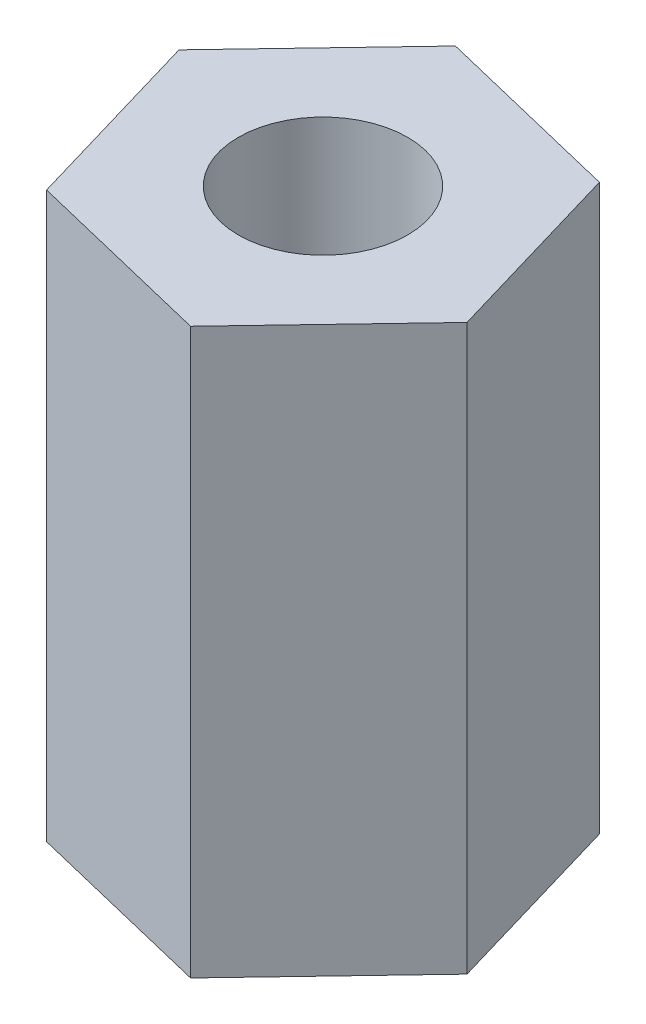
ISO-10303-21;
HEADER;
FILE_DESCRIPTION(('STEP AP214'),'2;1');
FILE_NAME('part.step','',(''),(''),'','','');
FILE_SCHEMA(('AUTOMOTIVE_DESIGN { 1 0 10303 214 1 1 1 1 }'));
ENDSEC;
DATA;
#1=APPLICATION_CONTEXT('core data for automotive mechanical design processes');
#2=APPLICATION_PROTOCOL_DEFINITION('international standard','automotive_design',2000,#1);
#3=PRODUCT_CONTEXT('',#1,'mechanical');
#4=PRODUCT('Part','Part','',(#3));
#5=PRODUCT_RELATED_PRODUCT_CATEGORY('part','',(#4));
#6=PRODUCT_DEFINITION_FORMATION('','',#4);
#7=PRODUCT_DEFINITION_CONTEXT('part definition',#1,'design');
#8=PRODUCT_DEFINITION('design','',#6,#7);
#9=PRODUCT_DEFINITION_SHAPE('','',#8);
#10=(LENGTH_UNIT() NAMED_UNIT(*) SI_UNIT(.MILLI.,.METRE.));
#11=(NAMED_UNIT(*) PLANE_ANGLE_UNIT() SI_UNIT($,.RADIAN.));
#12=(NAMED_UNIT(*) SI_UNIT($,.STERADIAN.) SOLID_ANGLE_UNIT());
#13=UNCERTAINTY_MEASURE_WITH_UNIT(LENGTH_MEASURE(1.E-05),#10,'distance_accuracy_value','');
#14=(GEOMETRIC_REPRESENTATION_CONTEXT(3) GLOBAL_UNCERTAINTY_ASSIGNED_CONTEXT((#13)) GLOBAL_UNIT_ASSIGNED_CONTEXT((#10,
#11,#12)) REPRESENTATION_CONTEXT('',''));
#15=CARTESIAN_POINT('',(0.,0.,0.));
#16=DIRECTION('',(0.,0.,1.));
#17=DIRECTION('',(1.,0.,0.));
#18=AXIS2_PLACEMENT_3D('',#15,#16,#17);
#19=CARTESIAN_POINT('',(0.,5.,0.));
#20=DIRECTION('',(0.,1.,0.));
#21=DIRECTION('',(0.,0.,1.));
#22=AXIS2_PLACEMENT_3D('',#19,#20,#21);
#23=PLANE('',#22);
#24=DIRECTION('',(0.971906320154711,0.,0.235368020009788));
#25=VECTOR('',#24,1.);
#26=CARTESIAN_POINT('',(-2.38949518673463,5.,2.50804959133029));
#27=LINE('',#26,#25);
#28=CARTESIAN_POINT('',(-2.38949518673463,5.,2.50804959133029));
#29=VERTEX_POINT('',#28);
#30=CARTESIAN_POINT('',(0.9772870666759,5.,3.32338832959798));
#31=VERTEX_POINT('',#30);
#32=EDGE_CURVE('E132',#29,#31,#27,.T.);
#33=ORIENTED_EDGE('',*,*,#32,.T.);
#34=DIRECTION('',(0.689787844644276,0.,-0.724011553347738));
#35=VECTOR('',#34,1.);
#36=CARTESIAN_POINT('',(0.9772870666759,5.,3.32338832959798));
#37=LINE('',#36,#35);
#38=CARTESIAN_POINT('',(3.36678225341053,5.,0.815338738267681));
#39=VERTEX_POINT('',#38);
#40=EDGE_CURVE('E90',#31,#39,#37,.T.);
#41=ORIENTED_EDGE('',*,*,#40,.T.);
#42=DIRECTION('',(-0.282118475510435,0.,-0.959379573357526));
#43=VECTOR('',#42,1.);
#44=CARTESIAN_POINT('',(3.36678225341053,5.,0.815338738267681));
#45=LINE('',#44,#43);
#46=CARTESIAN_POINT('',(2.38949518673463,5.,-2.50804959133029));
#47=VERTEX_POINT('',#46);
#48=EDGE_CURVE('E103',#39,#47,#45,.T.);
#49=ORIENTED_EDGE('',*,*,#48,.T.);
#50=DIRECTION('',(-0.971906320154711,0.,-0.235368020009788));
#51=VECTOR('',#50,1.);
#52=CARTESIAN_POINT('',(2.38949518673463,5.,-2.50804959133029));
#53=LINE('',#52,#51);
#54=CARTESIAN_POINT('',(-0.977287066675899,5.,-3.32338832959798));
#55=VERTEX_POINT('',#54);
#56=EDGE_CURVE('E97',#47,#55,#53,.T.);
#57=ORIENTED_EDGE('',*,*,#56,.T.);
#58=DIRECTION('',(-0.689787844644276,0.,0.724011553347738));
#59=VECTOR('',#58,1.);
#60=CARTESIAN_POINT('',(-0.977287066675899,5.,-3.32338832959798));
#61=LINE('',#60,#59);
#62=CARTESIAN_POINT('',(-3.36678225341053,5.,-0.815338738267681));
#63=VERTEX_POINT('',#62);
#64=EDGE_CURVE('E101',#55,#63,#61,.T.);
#65=ORIENTED_EDGE('',*,*,#64,.T.);
#66=DIRECTION('',(0.282118475510435,0.,0.959379573357526));
#67=VECTOR('',#66,1.);
#68=CARTESIAN_POINT('',(-3.36678225341053,5.,-0.815338738267681));
#69=LINE('',#68,#67);
#70=EDGE_CURVE('E53',#63,#29,#69,.T.);
#71=ORIENTED_EDGE('',*,*,#70,.T.);
#72=EDGE_LOOP('',(#33,#41,#49,#57,#65,#71));
#73=FACE_BOUND('',#72,.T.);
#74=CARTESIAN_POINT('',(0.,5.,0.));
#75=DIRECTION('',(0.,1.,0.));
#76=DIRECTION('',(0.,0.,1.));
#77=AXIS2_PLACEMENT_3D('',#74,#75,#76);
#78=CIRCLE('',#77,1.5);
#79=CARTESIAN_POINT('',(0.,5.,1.5));
#80=VERTEX_POINT('',#79);
#81=EDGE_CURVE('E125',#80,#80,#78,.T.);
#82=ORIENTED_EDGE('',*,*,#81,.F.);
#83=EDGE_LOOP('',(#82));
#84=FACE_BOUND('',#83,.T.);
#85=ADVANCED_FACE('F36',(#73,#84),#23,.T.);
#86=CARTESIAN_POINT('',(0.,-5.,0.));
#87=DIRECTION('',(0.,1.,0.));
#88=DIRECTION('',(0.,0.,1.));
#89=AXIS2_PLACEMENT_3D('',#86,#87,#88);
#90=PLANE('',#89);
#91=DIRECTION('',(0.971906320154711,0.,0.235368020009788));
#92=VECTOR('',#91,1.);
#93=CARTESIAN_POINT('',(-2.38949518673463,-5.,2.50804959133029));
#94=LINE('',#93,#92);
#95=CARTESIAN_POINT('',(-2.38949518673463,-5.,2.50804959133029));
#96=VERTEX_POINT('',#95);
#97=CARTESIAN_POINT('',(0.9772870666759,-5.,3.32338832959798));
#98=VERTEX_POINT('',#97);
#99=EDGE_CURVE('E121',#96,#98,#94,.T.);
#100=ORIENTED_EDGE('',*,*,#99,.F.);
#101=DIRECTION('',(0.282118475510435,0.,0.959379573357526));
#102=VECTOR('',#101,1.);
#103=CARTESIAN_POINT('',(-3.36678225341053,-5.,-0.815338738267681));
#104=LINE('',#103,#102);
#105=CARTESIAN_POINT('',(-3.36678225341053,-5.,-0.815338738267681));
#106=VERTEX_POINT('',#105);
#107=EDGE_CURVE('E82',#106,#96,#104,.T.);
#108=ORIENTED_EDGE('',*,*,#107,.F.);
#109=DIRECTION('',(-0.689787844644276,0.,0.724011553347738));
#110=VECTOR('',#109,1.);
#111=CARTESIAN_POINT('',(-0.977287066675899,-5.,-3.32338832959798));
#112=LINE('',#111,#110);
#113=CARTESIAN_POINT('',(-0.977287066675899,-5.,-3.32338832959798));
#114=VERTEX_POINT('',#113);
#115=EDGE_CURVE('E76',#114,#106,#112,.T.);
#116=ORIENTED_EDGE('',*,*,#115,.F.);
#117=DIRECTION('',(-0.971906320154711,0.,-0.235368020009788));
#118=VECTOR('',#117,1.);
#119=CARTESIAN_POINT('',(2.38949518673463,-5.,-2.50804959133029));
#120=LINE('',#119,#118);
#121=CARTESIAN_POINT('',(2.38949518673463,-5.,-2.50804959133029));
#122=VERTEX_POINT('',#121);
#123=EDGE_CURVE('E111',#122,#114,#120,.T.);
#124=ORIENTED_EDGE('',*,*,#123,.F.);
#125=DIRECTION('',(-0.282118475510435,0.,-0.959379573357526));
#126=VECTOR('',#125,1.);
#127=CARTESIAN_POINT('',(3.36678225341053,-5.,0.815338738267681));
#128=LINE('',#127,#126);
#129=CARTESIAN_POINT('',(3.36678225341053,-5.,0.815338738267681));
#130=VERTEX_POINT('',#129);
#131=EDGE_CURVE('E127',#130,#122,#128,.T.);
#132=ORIENTED_EDGE('',*,*,#131,.F.);
#133=DIRECTION('',(0.689787844644276,0.,-0.724011553347738));
#134=VECTOR('',#133,1.);
#135=CARTESIAN_POINT('',(0.9772870666759,-5.,3.32338832959798));
#136=LINE('',#135,#134);
#137=EDGE_CURVE('E124',#98,#130,#136,.T.);
#138=ORIENTED_EDGE('',*,*,#137,.F.);
#139=EDGE_LOOP('',(#100,#108,#116,#124,#132,#138));
#140=FACE_BOUND('',#139,.T.);
#141=CARTESIAN_POINT('',(0.,-5.,0.));
#142=DIRECTION('',(0.,1.,0.));
#143=DIRECTION('',(0.,0.,1.));
#144=AXIS2_PLACEMENT_3D('',#141,#142,#143);
#145=CIRCLE('',#144,1.5);
#146=CARTESIAN_POINT('',(0.,-5.,1.5));
#147=VERTEX_POINT('',#146);
#148=EDGE_CURVE('E225',#147,#147,#145,.T.);
#149=ORIENTED_EDGE('',*,*,#148,.T.);
#150=EDGE_LOOP('',(#149));
#151=FACE_BOUND('',#150,.T.);
#152=ADVANCED_FACE('F141',(#140,#151),#90,.F.);
#153=CARTESIAN_POINT('',(-2.38949518673463,5.,2.50804959133029));
#154=DIRECTION('',(0.235368020009788,0.,-0.971906320154711));
#155=DIRECTION('',(-0.971906320154711,0.,-0.235368020009788));
#156=AXIS2_PLACEMENT_3D('',#153,#154,#155);
#157=PLANE('',#156);
#158=ORIENTED_EDGE('',*,*,#99,.T.);
#159=DIRECTION('',(0.,-1.,0.));
#160=VECTOR('',#159,1.);
#161=CARTESIAN_POINT('',(0.9772870666759,5.,3.32338832959798));
#162=LINE('',#161,#160);
#163=EDGE_CURVE('E11',#31,#98,#162,.T.);
#164=ORIENTED_EDGE('',*,*,#163,.F.);
#165=ORIENTED_EDGE('',*,*,#32,.F.);
#166=DIRECTION('',(0.,-1.,0.));
#167=VECTOR('',#166,1.);
#168=CARTESIAN_POINT('',(-2.38949518673463,5.,2.50804959133029));
#169=LINE('',#168,#167);
#170=EDGE_CURVE('E117',#29,#96,#169,.T.);
#171=ORIENTED_EDGE('',*,*,#170,.T.);
#172=EDGE_LOOP('',(#158,#164,#165,#171));
#173=FACE_BOUND('',#172,.T.);
#174=ADVANCED_FACE('F38',(#173),#157,.F.);
#175=CARTESIAN_POINT('',(0.9772870666759,5.,3.32338832959798));
#176=DIRECTION('',(-0.724011553347738,0.,-0.689787844644276));
#177=DIRECTION('',(-0.689787844644276,0.,0.724011553347738));
#178=AXIS2_PLACEMENT_3D('',#175,#176,#177);
#179=PLANE('',#178);
#180=ORIENTED_EDGE('',*,*,#137,.T.);
#181=DIRECTION('',(0.,-1.,0.));
#182=VECTOR('',#181,1.);
#183=CARTESIAN_POINT('',(3.36678225341053,5.,0.815338738267681));
#184=LINE('',#183,#182);
#185=EDGE_CURVE('E45',#39,#130,#184,.T.);
#186=ORIENTED_EDGE('',*,*,#185,.F.);
#187=ORIENTED_EDGE('',*,*,#40,.F.);
#188=ORIENTED_EDGE('',*,*,#163,.T.);
#189=EDGE_LOOP('',(#180,#186,#187,#188));
#190=FACE_BOUND('',#189,.T.);
#191=ADVANCED_FACE('F166',(#190),#179,.F.);
#192=CARTESIAN_POINT('',(3.36678225341053,5.,0.815338738267681));
#193=DIRECTION('',(-0.959379573357526,0.,0.282118475510435));
#194=DIRECTION('',(0.282118475510435,0.,0.959379573357526));
#195=AXIS2_PLACEMENT_3D('',#192,#193,#194);
#196=PLANE('',#195);
#197=ORIENTED_EDGE('',*,*,#131,.T.);
#198=DIRECTION('',(0.,-1.,0.));
#199=VECTOR('',#198,1.);
#200=CARTESIAN_POINT('',(2.38949518673463,5.,-2.50804959133029));
#201=LINE('',#200,#199);
#202=EDGE_CURVE('E112',#47,#122,#201,.T.);
#203=ORIENTED_EDGE('',*,*,#202,.F.);
#204=ORIENTED_EDGE('',*,*,#48,.F.);
#205=ORIENTED_EDGE('',*,*,#185,.T.);
#206=EDGE_LOOP('',(#197,#203,#204,#205));
#207=FACE_BOUND('',#206,.T.);
#208=ADVANCED_FACE('F138',(#207),#196,.F.);
#209=CARTESIAN_POINT('',(2.38949518673463,5.,-2.50804959133029));
#210=DIRECTION('',(-0.235368020009788,0.,0.971906320154711));
#211=DIRECTION('',(0.971906320154711,0.,0.235368020009788));
#212=AXIS2_PLACEMENT_3D('',#209,#210,#211);
#213=PLANE('',#212);
#214=ORIENTED_EDGE('',*,*,#123,.T.);
#215=DIRECTION('',(0.,-1.,0.));
#216=VECTOR('',#215,1.);
#217=CARTESIAN_POINT('',(-0.977287066675899,5.,-3.32338832959798));
#218=LINE('',#217,#216);
#219=EDGE_CURVE('E108',#55,#114,#218,.T.);
#220=ORIENTED_EDGE('',*,*,#219,.F.);
#221=ORIENTED_EDGE('',*,*,#56,.F.);
#222=ORIENTED_EDGE('',*,*,#202,.T.);
#223=EDGE_LOOP('',(#214,#220,#221,#222));
#224=FACE_BOUND('',#223,.T.);
#225=ADVANCED_FACE('F109',(#224),#213,.F.);
#226=CARTESIAN_POINT('',(-0.977287066675899,5.,-3.32338832959798));
#227=DIRECTION('',(0.724011553347738,0.,0.689787844644276));
#228=DIRECTION('',(0.689787844644276,0.,-0.724011553347738));
#229=AXIS2_PLACEMENT_3D('',#226,#227,#228);
#230=PLANE('',#229);
#231=ORIENTED_EDGE('',*,*,#115,.T.);
#232=DIRECTION('',(0.,-1.,0.));
#233=VECTOR('',#232,1.);
#234=CARTESIAN_POINT('',(-3.36678225341053,5.,-0.815338738267681));
#235=LINE('',#234,#233);
#236=EDGE_CURVE('E113',#63,#106,#235,.T.);
#237=ORIENTED_EDGE('',*,*,#236,.F.);
#238=ORIENTED_EDGE('',*,*,#64,.F.);
#239=ORIENTED_EDGE('',*,*,#219,.T.);
#240=EDGE_LOOP('',(#231,#237,#238,#239));
#241=FACE_BOUND('',#240,.T.);
#242=ADVANCED_FACE('F115',(#241),#230,.F.);
#243=CARTESIAN_POINT('',(-3.36678225341053,5.,-0.815338738267681));
#244=DIRECTION('',(0.959379573357526,0.,-0.282118475510435));
#245=DIRECTION('',(-0.282118475510435,0.,-0.959379573357526));
#246=AXIS2_PLACEMENT_3D('',#243,#244,#245);
#247=PLANE('',#246);
#248=ORIENTED_EDGE('',*,*,#107,.T.);
#249=ORIENTED_EDGE('',*,*,#170,.F.);
#250=ORIENTED_EDGE('',*,*,#70,.F.);
#251=ORIENTED_EDGE('',*,*,#236,.T.);
#252=EDGE_LOOP('',(#248,#249,#250,#251));
#253=FACE_BOUND('',#252,.T.);
#254=ADVANCED_FACE('F146',(#253),#247,.F.);
#255=CARTESIAN_POINT('',(0.,5.,0.));
#256=DIRECTION('',(0.,-1.,0.));
#257=DIRECTION('',(0.,0.,-1.));
#258=AXIS2_PLACEMENT_3D('',#255,#256,#257);
#259=CYLINDRICAL_SURFACE('',#258,1.5);
#260=ORIENTED_EDGE('',*,*,#81,.T.);
#261=EDGE_LOOP('',(#260));
#262=FACE_BOUND('',#261,.T.);
#263=ORIENTED_EDGE('',*,*,#148,.F.);
#264=EDGE_LOOP('',(#263));
#265=FACE_BOUND('',#264,.T.);
#266=ADVANCED_FACE('F148',(#262,#265),#259,.F.);
#267=CLOSED_SHELL('',(#85,#152,#174,#191,#208,#225,#242,#254,#266));
#268=MANIFOLD_SOLID_BREP('B2',#267);
#269=ADVANCED_BREP_SHAPE_REPRESENTATION('',(#18,#268),#14);
#270=SHAPE_DEFINITION_REPRESENTATION(#9,#269);
ENDSEC;
END-ISO-10303-21;
